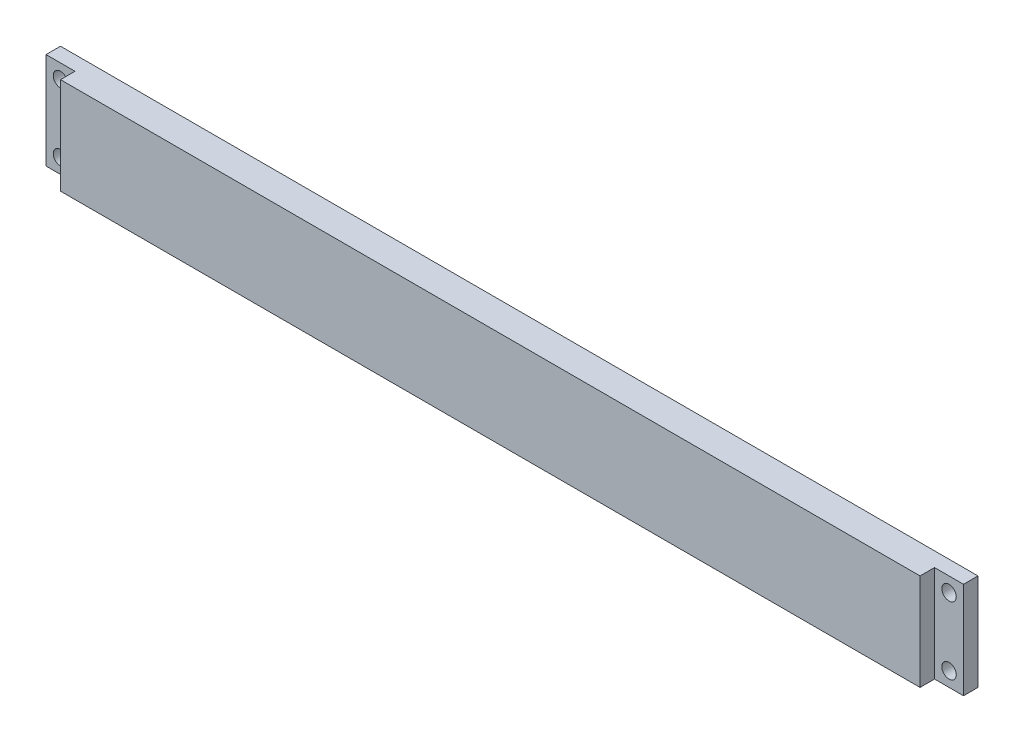
ISO-10303-21;
HEADER;
FILE_DESCRIPTION(('STEP AP214'),'2;1');
FILE_NAME('part.step','',(''),(''),'','','');
FILE_SCHEMA(('AUTOMOTIVE_DESIGN { 1 0 10303 214 1 1 1 1 }'));
ENDSEC;
DATA;
#1=APPLICATION_CONTEXT('core data for automotive mechanical design processes');
#2=APPLICATION_PROTOCOL_DEFINITION('international standard','automotive_design',2000,#1);
#3=PRODUCT_CONTEXT('',#1,'mechanical');
#4=PRODUCT('Part','Part','',(#3));
#5=PRODUCT_RELATED_PRODUCT_CATEGORY('part','',(#4));
#6=PRODUCT_DEFINITION_FORMATION('','',#4);
#7=PRODUCT_DEFINITION_CONTEXT('part definition',#1,'design');
#8=PRODUCT_DEFINITION('design','',#6,#7);
#9=PRODUCT_DEFINITION_SHAPE('','',#8);
#10=(LENGTH_UNIT() NAMED_UNIT(*) SI_UNIT(.MILLI.,.METRE.));
#11=(NAMED_UNIT(*) PLANE_ANGLE_UNIT() SI_UNIT($,.RADIAN.));
#12=(NAMED_UNIT(*) SI_UNIT($,.STERADIAN.) SOLID_ANGLE_UNIT());
#13=UNCERTAINTY_MEASURE_WITH_UNIT(LENGTH_MEASURE(1.E-05),#10,'distance_accuracy_value','');
#14=(GEOMETRIC_REPRESENTATION_CONTEXT(3) GLOBAL_UNCERTAINTY_ASSIGNED_CONTEXT((#13)) GLOBAL_UNIT_ASSIGNED_CONTEXT((#10,
#11,#12)) REPRESENTATION_CONTEXT('',''));
#15=CARTESIAN_POINT('',(0.,0.,0.));
#16=DIRECTION('',(0.,0.,1.));
#17=DIRECTION('',(1.,0.,0.));
#18=AXIS2_PLACEMENT_3D('',#15,#16,#17);
#19=CARTESIAN_POINT('',(95.,10.,6.));
#20=DIRECTION('',(-1.,0.,0.));
#21=DIRECTION('',(0.,0.,1.));
#22=AXIS2_PLACEMENT_3D('',#19,#20,#21);
#23=PLANE('',#22);
#24=DIRECTION('',(0.,1.,0.));
#25=VECTOR('',#24,1.);
#26=CARTESIAN_POINT('',(95.,10.,3.));
#27=LINE('',#26,#25);
#28=CARTESIAN_POINT('',(95.,-10.,3.));
#29=VERTEX_POINT('',#28);
#30=CARTESIAN_POINT('',(95.,10.,3.));
#31=VERTEX_POINT('',#30);
#32=EDGE_CURVE('E112',#29,#31,#27,.T.);
#33=ORIENTED_EDGE('',*,*,#32,.F.);
#34=DIRECTION('',(0.,0.,-1.));
#35=VECTOR('',#34,1.);
#36=CARTESIAN_POINT('',(95.,-10.,6.));
#37=LINE('',#36,#35);
#38=CARTESIAN_POINT('',(95.,-10.,0.));
#39=VERTEX_POINT('',#38);
#40=EDGE_CURVE('E43',#29,#39,#37,.T.);
#41=ORIENTED_EDGE('',*,*,#40,.T.);
#42=DIRECTION('',(0.,1.,0.));
#43=VECTOR('',#42,1.);
#44=CARTESIAN_POINT('',(95.,10.,0.));
#45=LINE('',#44,#43);
#46=CARTESIAN_POINT('',(95.,10.,0.));
#47=VERTEX_POINT('',#46);
#48=EDGE_CURVE('E153',#39,#47,#45,.T.);
#49=ORIENTED_EDGE('',*,*,#48,.T.);
#50=DIRECTION('',(0.,0.,-1.));
#51=VECTOR('',#50,1.);
#52=CARTESIAN_POINT('',(95.,10.,6.));
#53=LINE('',#52,#51);
#54=EDGE_CURVE('E159',#31,#47,#53,.T.);
#55=ORIENTED_EDGE('',*,*,#54,.F.);
#56=EDGE_LOOP('',(#33,#41,#49,#55));
#57=FACE_BOUND('',#56,.T.);
#58=ADVANCED_FACE('F34',(#57),#23,.F.);
#59=CARTESIAN_POINT('',(-95.,10.,6.));
#60=DIRECTION('',(1.,0.,0.));
#61=DIRECTION('',(0.,0.,-1.));
#62=AXIS2_PLACEMENT_3D('',#59,#60,#61);
#63=PLANE('',#62);
#64=DIRECTION('',(0.,-1.,0.));
#65=VECTOR('',#64,1.);
#66=CARTESIAN_POINT('',(-95.,10.,3.));
#67=LINE('',#66,#65);
#68=CARTESIAN_POINT('',(-95.,10.,3.));
#69=VERTEX_POINT('',#68);
#70=CARTESIAN_POINT('',(-95.,-10.,3.));
#71=VERTEX_POINT('',#70);
#72=EDGE_CURVE('E127',#69,#71,#67,.T.);
#73=ORIENTED_EDGE('',*,*,#72,.F.);
#74=DIRECTION('',(0.,0.,-1.));
#75=VECTOR('',#74,1.);
#76=CARTESIAN_POINT('',(-95.,10.,6.));
#77=LINE('',#76,#75);
#78=CARTESIAN_POINT('',(-95.,10.,0.));
#79=VERTEX_POINT('',#78);
#80=EDGE_CURVE('E147',#69,#79,#77,.T.);
#81=ORIENTED_EDGE('',*,*,#80,.T.);
#82=DIRECTION('',(0.,-1.,0.));
#83=VECTOR('',#82,1.);
#84=CARTESIAN_POINT('',(-95.,10.,0.));
#85=LINE('',#84,#83);
#86=CARTESIAN_POINT('',(-95.,-10.,0.));
#87=VERTEX_POINT('',#86);
#88=EDGE_CURVE('E140',#79,#87,#85,.T.);
#89=ORIENTED_EDGE('',*,*,#88,.T.);
#90=DIRECTION('',(0.,0.,-1.));
#91=VECTOR('',#90,1.);
#92=CARTESIAN_POINT('',(-95.,-10.,6.));
#93=LINE('',#92,#91);
#94=EDGE_CURVE('E11',#71,#87,#93,.T.);
#95=ORIENTED_EDGE('',*,*,#94,.F.);
#96=EDGE_LOOP('',(#73,#81,#89,#95));
#97=FACE_BOUND('',#96,.T.);
#98=ADVANCED_FACE('F36',(#97),#63,.F.);
#99=CARTESIAN_POINT('',(-95.,-10.,6.));
#100=DIRECTION('',(0.,1.,0.));
#101=DIRECTION('',(-1.,0.,0.));
#102=AXIS2_PLACEMENT_3D('',#99,#100,#101);
#103=PLANE('',#102);
#104=DIRECTION('',(1.,0.,0.));
#105=VECTOR('',#104,1.);
#106=CARTESIAN_POINT('',(95.,-10.,3.));
#107=LINE('',#106,#105);
#108=CARTESIAN_POINT('',(89.,-10.,3.));
#109=VERTEX_POINT('',#108);
#110=EDGE_CURVE('E106',#109,#29,#107,.T.);
#111=ORIENTED_EDGE('',*,*,#110,.F.);
#112=DIRECTION('',(0.,0.,1.));
#113=VECTOR('',#112,1.);
#114=CARTESIAN_POINT('',(89.,-10.,3.));
#115=LINE('',#114,#113);
#116=CARTESIAN_POINT('',(89.,-10.,6.));
#117=VERTEX_POINT('',#116);
#118=EDGE_CURVE('E103',#109,#117,#115,.T.);
#119=ORIENTED_EDGE('',*,*,#118,.T.);
#120=DIRECTION('',(1.,0.,0.));
#121=VECTOR('',#120,1.);
#122=CARTESIAN_POINT('',(-95.,-10.,6.));
#123=LINE('',#122,#121);
#124=CARTESIAN_POINT('',(-89.,-10.,6.));
#125=VERTEX_POINT('',#124);
#126=EDGE_CURVE('E142',#125,#117,#123,.T.);
#127=ORIENTED_EDGE('',*,*,#126,.F.);
#128=DIRECTION('',(0.,0.,1.));
#129=VECTOR('',#128,1.);
#130=CARTESIAN_POINT('',(-89.,-10.,3.));
#131=LINE('',#130,#129);
#132=CARTESIAN_POINT('',(-89.,-10.,3.));
#133=VERTEX_POINT('',#132);
#134=EDGE_CURVE('E59',#133,#125,#131,.T.);
#135=ORIENTED_EDGE('',*,*,#134,.F.);
#136=DIRECTION('',(1.,0.,0.));
#137=VECTOR('',#136,1.);
#138=CARTESIAN_POINT('',(-95.,-10.,3.));
#139=LINE('',#138,#137);
#140=EDGE_CURVE('E129',#71,#133,#139,.T.);
#141=ORIENTED_EDGE('',*,*,#140,.F.);
#142=ORIENTED_EDGE('',*,*,#94,.T.);
#143=DIRECTION('',(1.,0.,0.));
#144=VECTOR('',#143,1.);
#145=CARTESIAN_POINT('',(-95.,-10.,0.));
#146=LINE('',#145,#144);
#147=EDGE_CURVE('E150',#87,#39,#146,.T.);
#148=ORIENTED_EDGE('',*,*,#147,.T.);
#149=ORIENTED_EDGE('',*,*,#40,.F.);
#150=EDGE_LOOP('',(#111,#119,#127,#135,#141,#142,#148,#149));
#151=FACE_BOUND('',#150,.T.);
#152=ADVANCED_FACE('F189',(#151),#103,.F.);
#153=CARTESIAN_POINT('',(-95.,10.,6.));
#154=DIRECTION('',(0.,-1.,0.));
#155=DIRECTION('',(1.,0.,0.));
#156=AXIS2_PLACEMENT_3D('',#153,#154,#155);
#157=PLANE('',#156);
#158=DIRECTION('',(-1.,0.,0.));
#159=VECTOR('',#158,1.);
#160=CARTESIAN_POINT('',(-95.,10.,6.));
#161=LINE('',#160,#159);
#162=CARTESIAN_POINT('',(89.,10.,6.));
#163=VERTEX_POINT('',#162);
#164=CARTESIAN_POINT('',(-89.,10.,6.));
#165=VERTEX_POINT('',#164);
#166=EDGE_CURVE('E120',#163,#165,#161,.T.);
#167=ORIENTED_EDGE('',*,*,#166,.F.);
#168=DIRECTION('',(0.,0.,1.));
#169=VECTOR('',#168,1.);
#170=CARTESIAN_POINT('',(89.,10.,3.));
#171=LINE('',#170,#169);
#172=CARTESIAN_POINT('',(89.,10.,3.));
#173=VERTEX_POINT('',#172);
#174=EDGE_CURVE('E51',#173,#163,#171,.T.);
#175=ORIENTED_EDGE('',*,*,#174,.F.);
#176=DIRECTION('',(-1.,0.,0.));
#177=VECTOR('',#176,1.);
#178=CARTESIAN_POINT('',(95.,10.,3.));
#179=LINE('',#178,#177);
#180=EDGE_CURVE('E107',#31,#173,#179,.T.);
#181=ORIENTED_EDGE('',*,*,#180,.F.);
#182=ORIENTED_EDGE('',*,*,#54,.T.);
#183=DIRECTION('',(-1.,0.,0.));
#184=VECTOR('',#183,1.);
#185=CARTESIAN_POINT('',(-95.,10.,0.));
#186=LINE('',#185,#184);
#187=EDGE_CURVE('E145',#47,#79,#186,.T.);
#188=ORIENTED_EDGE('',*,*,#187,.T.);
#189=ORIENTED_EDGE('',*,*,#80,.F.);
#190=DIRECTION('',(-1.,0.,0.));
#191=VECTOR('',#190,1.);
#192=CARTESIAN_POINT('',(-95.,10.,3.));
#193=LINE('',#192,#191);
#194=CARTESIAN_POINT('',(-89.,10.,3.));
#195=VERTEX_POINT('',#194);
#196=EDGE_CURVE('E135',#195,#69,#193,.T.);
#197=ORIENTED_EDGE('',*,*,#196,.F.);
#198=DIRECTION('',(0.,0.,1.));
#199=VECTOR('',#198,1.);
#200=CARTESIAN_POINT('',(-89.,10.,3.));
#201=LINE('',#200,#199);
#202=EDGE_CURVE('E138',#195,#165,#201,.T.);
#203=ORIENTED_EDGE('',*,*,#202,.T.);
#204=EDGE_LOOP('',(#167,#175,#181,#182,#188,#189,#197,#203));
#205=FACE_BOUND('',#204,.T.);
#206=ADVANCED_FACE('F118',(#205),#157,.F.);
#207=CARTESIAN_POINT('',(0.,0.,6.));
#208=DIRECTION('',(0.,0.,1.));
#209=DIRECTION('',(1.,0.,0.));
#210=AXIS2_PLACEMENT_3D('',#207,#208,#209);
#211=PLANE('',#210);
#212=DIRECTION('',(0.,-1.,0.));
#213=VECTOR('',#212,1.);
#214=CARTESIAN_POINT('',(89.,10.,6.));
#215=LINE('',#214,#213);
#216=EDGE_CURVE('E115',#163,#117,#215,.T.);
#217=ORIENTED_EDGE('',*,*,#216,.F.);
#218=ORIENTED_EDGE('',*,*,#166,.T.);
#219=DIRECTION('',(0.,1.,0.));
#220=VECTOR('',#219,1.);
#221=CARTESIAN_POINT('',(-89.,10.,6.));
#222=LINE('',#221,#220);
#223=EDGE_CURVE('E122',#125,#165,#222,.T.);
#224=ORIENTED_EDGE('',*,*,#223,.F.);
#225=ORIENTED_EDGE('',*,*,#126,.T.);
#226=EDGE_LOOP('',(#217,#218,#224,#225));
#227=FACE_BOUND('',#226,.T.);
#228=ADVANCED_FACE('F191',(#227),#211,.T.);
#229=CARTESIAN_POINT('',(0.,0.,0.));
#230=DIRECTION('',(0.,0.,1.));
#231=DIRECTION('',(1.,0.,0.));
#232=AXIS2_PLACEMENT_3D('',#229,#230,#231);
#233=PLANE('',#232);
#234=CARTESIAN_POINT('',(-92.,-7.,0.));
#235=DIRECTION('',(0.,0.,-1.));
#236=DIRECTION('',(1.,0.,0.));
#237=AXIS2_PLACEMENT_3D('',#234,#235,#236);
#238=CIRCLE('',#237,1.5);
#239=CARTESIAN_POINT('',(-90.5,-7.,0.));
#240=VERTEX_POINT('',#239);
#241=EDGE_CURVE('E181',#240,#240,#238,.T.);
#242=ORIENTED_EDGE('',*,*,#241,.F.);
#243=EDGE_LOOP('',(#242));
#244=FACE_BOUND('',#243,.T.);
#245=CARTESIAN_POINT('',(-92.,7.,0.));
#246=DIRECTION('',(0.,0.,-1.));
#247=DIRECTION('',(1.,0.,0.));
#248=AXIS2_PLACEMENT_3D('',#245,#246,#247);
#249=CIRCLE('',#248,1.5);
#250=CARTESIAN_POINT('',(-90.5,7.,0.));
#251=VERTEX_POINT('',#250);
#252=EDGE_CURVE('E171',#251,#251,#249,.T.);
#253=ORIENTED_EDGE('',*,*,#252,.F.);
#254=EDGE_LOOP('',(#253));
#255=FACE_BOUND('',#254,.T.);
#256=CARTESIAN_POINT('',(92.,7.,0.));
#257=DIRECTION('',(0.,0.,-1.));
#258=DIRECTION('',(-1.,0.,0.));
#259=AXIS2_PLACEMENT_3D('',#256,#257,#258);
#260=CIRCLE('',#259,1.5);
#261=CARTESIAN_POINT('',(90.5,7.,0.));
#262=VERTEX_POINT('',#261);
#263=EDGE_CURVE('E168',#262,#262,#260,.T.);
#264=ORIENTED_EDGE('',*,*,#263,.F.);
#265=EDGE_LOOP('',(#264));
#266=FACE_BOUND('',#265,.T.);
#267=CARTESIAN_POINT('',(92.,-7.,0.));
#268=DIRECTION('',(0.,0.,-1.));
#269=DIRECTION('',(-1.,0.,0.));
#270=AXIS2_PLACEMENT_3D('',#267,#268,#269);
#271=CIRCLE('',#270,1.5);
#272=CARTESIAN_POINT('',(90.5,-7.,0.));
#273=VERTEX_POINT('',#272);
#274=EDGE_CURVE('E165',#273,#273,#271,.T.);
#275=ORIENTED_EDGE('',*,*,#274,.F.);
#276=EDGE_LOOP('',(#275));
#277=FACE_BOUND('',#276,.T.);
#278=ORIENTED_EDGE('',*,*,#88,.F.);
#279=ORIENTED_EDGE('',*,*,#187,.F.);
#280=ORIENTED_EDGE('',*,*,#48,.F.);
#281=ORIENTED_EDGE('',*,*,#147,.F.);
#282=EDGE_LOOP('',(#278,#279,#280,#281));
#283=FACE_BOUND('',#282,.T.);
#284=ADVANCED_FACE('F205',(#244,#255,#266,#277,#283),#233,.F.);
#285=CARTESIAN_POINT('',(-89.,10.,3.));
#286=DIRECTION('',(1.,0.,0.));
#287=DIRECTION('',(0.,0.,-1.));
#288=AXIS2_PLACEMENT_3D('',#285,#286,#287);
#289=PLANE('',#288);
#290=ORIENTED_EDGE('',*,*,#223,.T.);
#291=ORIENTED_EDGE('',*,*,#202,.F.);
#292=DIRECTION('',(0.,1.,0.));
#293=VECTOR('',#292,1.);
#294=CARTESIAN_POINT('',(-89.,10.,3.));
#295=LINE('',#294,#293);
#296=EDGE_CURVE('E132',#133,#195,#295,.T.);
#297=ORIENTED_EDGE('',*,*,#296,.F.);
#298=ORIENTED_EDGE('',*,*,#134,.T.);
#299=EDGE_LOOP('',(#290,#291,#297,#298));
#300=FACE_BOUND('',#299,.T.);
#301=ADVANCED_FACE('F192',(#300),#289,.F.);
#302=CARTESIAN_POINT('',(0.,0.,3.));
#303=DIRECTION('',(0.,0.,1.));
#304=DIRECTION('',(1.,0.,0.));
#305=AXIS2_PLACEMENT_3D('',#302,#303,#304);
#306=PLANE('',#305);
#307=CARTESIAN_POINT('',(-92.,-7.,3.));
#308=DIRECTION('',(0.,0.,1.));
#309=DIRECTION('',(1.,0.,0.));
#310=AXIS2_PLACEMENT_3D('',#307,#308,#309);
#311=CIRCLE('',#310,1.5);
#312=CARTESIAN_POINT('',(-90.5,-7.,3.));
#313=VERTEX_POINT('',#312);
#314=EDGE_CURVE('E38',#313,#313,#311,.T.);
#315=ORIENTED_EDGE('',*,*,#314,.F.);
#316=EDGE_LOOP('',(#315));
#317=FACE_BOUND('',#316,.T.);
#318=CARTESIAN_POINT('',(-92.,7.,3.));
#319=DIRECTION('',(0.,0.,1.));
#320=DIRECTION('',(1.,0.,0.));
#321=AXIS2_PLACEMENT_3D('',#318,#319,#320);
#322=CIRCLE('',#321,1.5);
#323=CARTESIAN_POINT('',(-90.5,7.,3.));
#324=VERTEX_POINT('',#323);
#325=EDGE_CURVE('E169',#324,#324,#322,.T.);
#326=ORIENTED_EDGE('',*,*,#325,.F.);
#327=EDGE_LOOP('',(#326));
#328=FACE_BOUND('',#327,.T.);
#329=ORIENTED_EDGE('',*,*,#72,.T.);
#330=ORIENTED_EDGE('',*,*,#140,.T.);
#331=ORIENTED_EDGE('',*,*,#296,.T.);
#332=ORIENTED_EDGE('',*,*,#196,.T.);
#333=EDGE_LOOP('',(#329,#330,#331,#332));
#334=FACE_BOUND('',#333,.T.);
#335=ADVANCED_FACE('F197',(#317,#328,#334),#306,.T.);
#336=CARTESIAN_POINT('',(89.,10.,3.));
#337=DIRECTION('',(-1.,0.,0.));
#338=DIRECTION('',(0.,0.,1.));
#339=AXIS2_PLACEMENT_3D('',#336,#337,#338);
#340=PLANE('',#339);
#341=ORIENTED_EDGE('',*,*,#216,.T.);
#342=ORIENTED_EDGE('',*,*,#118,.F.);
#343=DIRECTION('',(0.,-1.,0.));
#344=VECTOR('',#343,1.);
#345=CARTESIAN_POINT('',(89.,10.,3.));
#346=LINE('',#345,#344);
#347=EDGE_CURVE('E99',#173,#109,#346,.T.);
#348=ORIENTED_EDGE('',*,*,#347,.F.);
#349=ORIENTED_EDGE('',*,*,#174,.T.);
#350=EDGE_LOOP('',(#341,#342,#348,#349));
#351=FACE_BOUND('',#350,.T.);
#352=ADVANCED_FACE('F101',(#351),#340,.F.);
#353=CARTESIAN_POINT('',(0.,0.,3.));
#354=DIRECTION('',(0.,0.,1.));
#355=DIRECTION('',(1.,0.,0.));
#356=AXIS2_PLACEMENT_3D('',#353,#354,#355);
#357=PLANE('',#356);
#358=CARTESIAN_POINT('',(92.,7.,3.));
#359=DIRECTION('',(0.,0.,1.));
#360=DIRECTION('',(1.,0.,0.));
#361=AXIS2_PLACEMENT_3D('',#358,#359,#360);
#362=CIRCLE('',#361,1.5);
#363=CARTESIAN_POINT('',(93.5,7.,3.));
#364=VERTEX_POINT('',#363);
#365=EDGE_CURVE('E166',#364,#364,#362,.T.);
#366=ORIENTED_EDGE('',*,*,#365,.F.);
#367=EDGE_LOOP('',(#366));
#368=FACE_BOUND('',#367,.T.);
#369=CARTESIAN_POINT('',(92.,-7.,3.));
#370=DIRECTION('',(0.,0.,1.));
#371=DIRECTION('',(1.,0.,0.));
#372=AXIS2_PLACEMENT_3D('',#369,#370,#371);
#373=CIRCLE('',#372,1.5);
#374=CARTESIAN_POINT('',(93.5,-7.,3.));
#375=VERTEX_POINT('',#374);
#376=EDGE_CURVE('E162',#375,#375,#373,.T.);
#377=ORIENTED_EDGE('',*,*,#376,.F.);
#378=EDGE_LOOP('',(#377));
#379=FACE_BOUND('',#378,.T.);
#380=ORIENTED_EDGE('',*,*,#180,.T.);
#381=ORIENTED_EDGE('',*,*,#347,.T.);
#382=ORIENTED_EDGE('',*,*,#110,.T.);
#383=ORIENTED_EDGE('',*,*,#32,.T.);
#384=EDGE_LOOP('',(#380,#381,#382,#383));
#385=FACE_BOUND('',#384,.T.);
#386=ADVANCED_FACE('F110',(#368,#379,#385),#357,.T.);
#387=CARTESIAN_POINT('',(92.,-7.,6.));
#388=DIRECTION('',(0.,0.,-1.));
#389=DIRECTION('',(-1.,0.,0.));
#390=AXIS2_PLACEMENT_3D('',#387,#388,#389);
#391=CYLINDRICAL_SURFACE('',#390,1.5);
#392=ORIENTED_EDGE('',*,*,#376,.T.);
#393=EDGE_LOOP('',(#392));
#394=FACE_BOUND('',#393,.T.);
#395=ORIENTED_EDGE('',*,*,#274,.T.);
#396=EDGE_LOOP('',(#395));
#397=FACE_BOUND('',#396,.T.);
#398=ADVANCED_FACE('F238',(#394,#397),#391,.F.);
#399=CARTESIAN_POINT('',(92.,7.,6.));
#400=DIRECTION('',(0.,0.,-1.));
#401=DIRECTION('',(-1.,0.,0.));
#402=AXIS2_PLACEMENT_3D('',#399,#400,#401);
#403=CYLINDRICAL_SURFACE('',#402,1.5);
#404=ORIENTED_EDGE('',*,*,#365,.T.);
#405=EDGE_LOOP('',(#404));
#406=FACE_BOUND('',#405,.T.);
#407=ORIENTED_EDGE('',*,*,#263,.T.);
#408=EDGE_LOOP('',(#407));
#409=FACE_BOUND('',#408,.T.);
#410=ADVANCED_FACE('F242',(#406,#409),#403,.F.);
#411=CARTESIAN_POINT('',(-92.,7.,6.));
#412=DIRECTION('',(0.,0.,-1.));
#413=DIRECTION('',(-1.,0.,0.));
#414=AXIS2_PLACEMENT_3D('',#411,#412,#413);
#415=CYLINDRICAL_SURFACE('',#414,1.5);
#416=ORIENTED_EDGE('',*,*,#325,.T.);
#417=EDGE_LOOP('',(#416));
#418=FACE_BOUND('',#417,.T.);
#419=ORIENTED_EDGE('',*,*,#252,.T.);
#420=EDGE_LOOP('',(#419));
#421=FACE_BOUND('',#420,.T.);
#422=ADVANCED_FACE('F246',(#418,#421),#415,.F.);
#423=CARTESIAN_POINT('',(-92.,-7.,6.));
#424=DIRECTION('',(0.,0.,-1.));
#425=DIRECTION('',(-1.,0.,0.));
#426=AXIS2_PLACEMENT_3D('',#423,#424,#425);
#427=CYLINDRICAL_SURFACE('',#426,1.5);
#428=ORIENTED_EDGE('',*,*,#314,.T.);
#429=EDGE_LOOP('',(#428));
#430=FACE_BOUND('',#429,.T.);
#431=ORIENTED_EDGE('',*,*,#241,.T.);
#432=EDGE_LOOP('',(#431));
#433=FACE_BOUND('',#432,.T.);
#434=ADVANCED_FACE('F250',(#430,#433),#427,.F.);
#435=CLOSED_SHELL('',(#58,#98,#152,#206,#228,#284,#301,#335,#352,#386,#398,#410,#422,#434));
#436=MANIFOLD_SOLID_BREP('B2',#435);
#437=ADVANCED_BREP_SHAPE_REPRESENTATION('',(#18,#436),#14);
#438=SHAPE_DEFINITION_REPRESENTATION(#9,#437);
ENDSEC;
END-ISO-10303-21;
